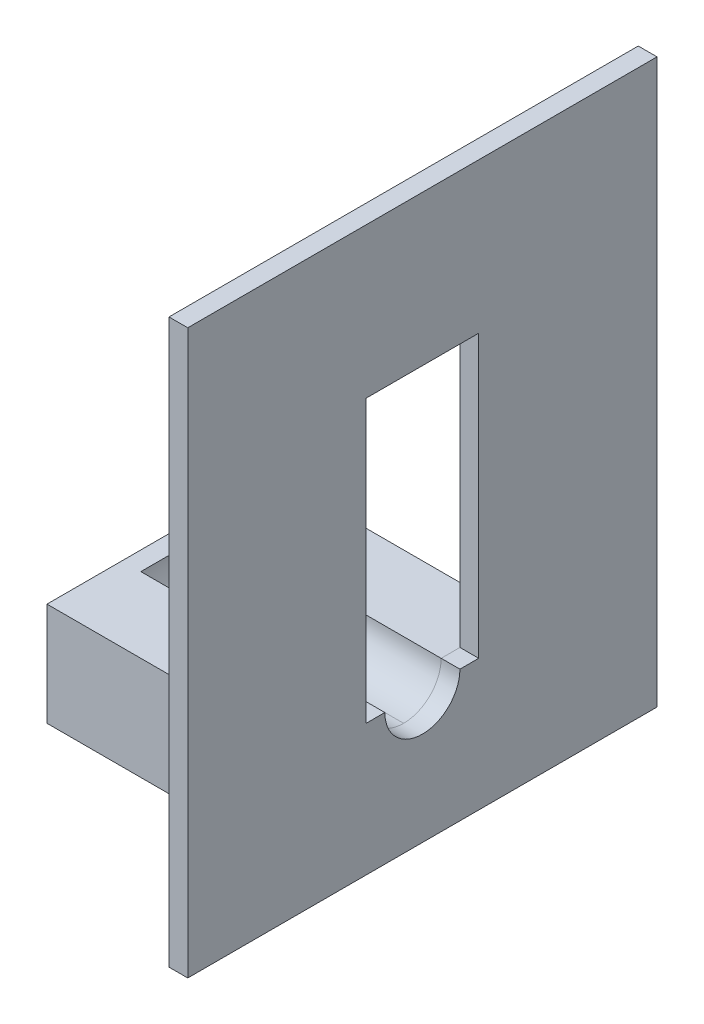
ISO-10303-21;
HEADER;
FILE_DESCRIPTION(('STEP AP214'),'2;1');
FILE_NAME('part.step','',(''),(''),'','','');
FILE_SCHEMA(('AUTOMOTIVE_DESIGN { 1 0 10303 214 1 1 1 1 }'));
ENDSEC;
DATA;
#1=APPLICATION_CONTEXT('core data for automotive mechanical design processes');
#2=APPLICATION_PROTOCOL_DEFINITION('international standard','automotive_design',2000,#1);
#3=PRODUCT_CONTEXT('',#1,'mechanical');
#4=PRODUCT('Part','Part','',(#3));
#5=PRODUCT_RELATED_PRODUCT_CATEGORY('part','',(#4));
#6=PRODUCT_DEFINITION_FORMATION('','',#4);
#7=PRODUCT_DEFINITION_CONTEXT('part definition',#1,'design');
#8=PRODUCT_DEFINITION('design','',#6,#7);
#9=PRODUCT_DEFINITION_SHAPE('','',#8);
#10=(LENGTH_UNIT() NAMED_UNIT(*) SI_UNIT(.MILLI.,.METRE.));
#11=(NAMED_UNIT(*) PLANE_ANGLE_UNIT() SI_UNIT($,.RADIAN.));
#12=(NAMED_UNIT(*) SI_UNIT($,.STERADIAN.) SOLID_ANGLE_UNIT());
#13=UNCERTAINTY_MEASURE_WITH_UNIT(LENGTH_MEASURE(1.E-05),#10,'distance_accuracy_value','');
#14=(GEOMETRIC_REPRESENTATION_CONTEXT(3) GLOBAL_UNCERTAINTY_ASSIGNED_CONTEXT((#13)) GLOBAL_UNIT_ASSIGNED_CONTEXT((#10,
#11,#12)) REPRESENTATION_CONTEXT('',''));
#15=CARTESIAN_POINT('',(0.,0.,0.));
#16=DIRECTION('',(0.,0.,1.));
#17=DIRECTION('',(1.,0.,0.));
#18=AXIS2_PLACEMENT_3D('',#15,#16,#17);
#19=CARTESIAN_POINT('',(7.5,0.,0.));
#20=DIRECTION('',(1.,0.,0.));
#21=DIRECTION('',(0.,0.,-1.));
#22=AXIS2_PLACEMENT_3D('',#19,#20,#21);
#23=PLANE('',#22);
#24=DIRECTION('',(0.,-1.,0.));
#25=VECTOR('',#24,1.);
#26=CARTESIAN_POINT('',(7.5,25.5,12.5));
#27=LINE('',#26,#25);
#28=CARTESIAN_POINT('',(7.5,25.5,12.5));
#29=VERTEX_POINT('',#28);
#30=CARTESIAN_POINT('',(7.5,-4.5,12.5));
#31=VERTEX_POINT('',#30);
#32=EDGE_CURVE('E172',#29,#31,#27,.T.);
#33=ORIENTED_EDGE('',*,*,#32,.T.);
#34=DIRECTION('',(0.,0.,-1.));
#35=VECTOR('',#34,1.);
#36=CARTESIAN_POINT('',(7.5,-4.5,12.5));
#37=LINE('',#36,#35);
#38=CARTESIAN_POINT('',(7.5,-4.49999999999999,-12.5));
#39=VERTEX_POINT('',#38);
#40=EDGE_CURVE('E175',#31,#39,#37,.T.);
#41=ORIENTED_EDGE('',*,*,#40,.T.);
#42=DIRECTION('',(0.,1.,0.));
#43=VECTOR('',#42,1.);
#44=CARTESIAN_POINT('',(7.5,25.5,-12.5));
#45=LINE('',#44,#43);
#46=CARTESIAN_POINT('',(7.5,25.5,-12.5));
#47=VERTEX_POINT('',#46);
#48=EDGE_CURVE('E178',#39,#47,#45,.T.);
#49=ORIENTED_EDGE('',*,*,#48,.T.);
#50=DIRECTION('',(0.,0.,1.));
#51=VECTOR('',#50,1.);
#52=CARTESIAN_POINT('',(7.5,25.5,12.5));
#53=LINE('',#52,#51);
#54=EDGE_CURVE('E180',#47,#29,#53,.T.);
#55=ORIENTED_EDGE('',*,*,#54,.T.);
#56=EDGE_LOOP('',(#33,#41,#49,#55));
#57=FACE_BOUND('',#56,.T.);
#58=DIRECTION('',(0.,0.,1.));
#59=VECTOR('',#58,1.);
#60=CARTESIAN_POINT('',(7.5,17.5,3.));
#61=LINE('',#60,#59);
#62=CARTESIAN_POINT('',(7.5,17.5,-3.));
#63=VERTEX_POINT('',#62);
#64=CARTESIAN_POINT('',(7.5,17.5,3.));
#65=VERTEX_POINT('',#64);
#66=EDGE_CURVE('E129',#63,#65,#61,.T.);
#67=ORIENTED_EDGE('',*,*,#66,.F.);
#68=DIRECTION('',(0.,1.,0.));
#69=VECTOR('',#68,1.);
#70=CARTESIAN_POINT('',(7.5,2.5,-3.));
#71=LINE('',#70,#69);
#72=CARTESIAN_POINT('',(7.5,2.5,-3.));
#73=VERTEX_POINT('',#72);
#74=EDGE_CURVE('E121',#73,#63,#71,.T.);
#75=ORIENTED_EDGE('',*,*,#74,.F.);
#76=DIRECTION('',(0.,0.,-1.));
#77=VECTOR('',#76,1.);
#78=CARTESIAN_POINT('',(7.5,2.5,-2.));
#79=LINE('',#78,#77);
#80=CARTESIAN_POINT('',(7.5,2.5,-2.));
#81=VERTEX_POINT('',#80);
#82=EDGE_CURVE('E150',#81,#73,#79,.T.);
#83=ORIENTED_EDGE('',*,*,#82,.F.);
#84=CARTESIAN_POINT('',(7.5,2.5,0.));
#85=DIRECTION('',(1.,0.,0.));
#86=DIRECTION('',(0.,0.,-1.));
#87=AXIS2_PLACEMENT_3D('',#84,#85,#86);
#88=CIRCLE('',#87,2.);
#89=CARTESIAN_POINT('',(7.5,2.5,2.));
#90=VERTEX_POINT('',#89);
#91=EDGE_CURVE('E148',#90,#81,#88,.T.);
#92=ORIENTED_EDGE('',*,*,#91,.F.);
#93=DIRECTION('',(0.,0.,-1.));
#94=VECTOR('',#93,1.);
#95=CARTESIAN_POINT('',(7.5,2.5,2.));
#96=LINE('',#95,#94);
#97=CARTESIAN_POINT('',(7.5,2.5,3.));
#98=VERTEX_POINT('',#97);
#99=EDGE_CURVE('E144',#98,#90,#96,.T.);
#100=ORIENTED_EDGE('',*,*,#99,.F.);
#101=DIRECTION('',(0.,-1.,0.));
#102=VECTOR('',#101,1.);
#103=CARTESIAN_POINT('',(7.5,2.5,3.));
#104=LINE('',#103,#102);
#105=EDGE_CURVE('E142',#65,#98,#104,.T.);
#106=ORIENTED_EDGE('',*,*,#105,.F.);
#107=EDGE_LOOP('',(#67,#75,#83,#92,#100,#106));
#108=FACE_BOUND('',#107,.T.);
#109=ADVANCED_FACE('F44',(#57,#108),#23,.T.);
#110=CARTESIAN_POINT('',(6.5,0.,0.));
#111=DIRECTION('',(1.,0.,0.));
#112=DIRECTION('',(0.,0.,-1.));
#113=AXIS2_PLACEMENT_3D('',#110,#111,#112);
#114=PLANE('',#113);
#115=DIRECTION('',(0.,-1.,0.));
#116=VECTOR('',#115,1.);
#117=CARTESIAN_POINT('',(6.5,25.5,12.5));
#118=LINE('',#117,#116);
#119=CARTESIAN_POINT('',(6.5,25.5,12.5));
#120=VERTEX_POINT('',#119);
#121=CARTESIAN_POINT('',(6.5,-4.5,12.5));
#122=VERTEX_POINT('',#121);
#123=EDGE_CURVE('E137',#120,#122,#118,.T.);
#124=ORIENTED_EDGE('',*,*,#123,.F.);
#125=DIRECTION('',(0.,0.,1.));
#126=VECTOR('',#125,1.);
#127=CARTESIAN_POINT('',(6.5,25.5,12.5));
#128=LINE('',#127,#126);
#129=CARTESIAN_POINT('',(6.5,25.5,-12.5));
#130=VERTEX_POINT('',#129);
#131=EDGE_CURVE('E176',#130,#120,#128,.T.);
#132=ORIENTED_EDGE('',*,*,#131,.F.);
#133=DIRECTION('',(0.,1.,0.));
#134=VECTOR('',#133,1.);
#135=CARTESIAN_POINT('',(6.5,25.5,-12.5));
#136=LINE('',#135,#134);
#137=CARTESIAN_POINT('',(6.5,-4.49999999999999,-12.5));
#138=VERTEX_POINT('',#137);
#139=EDGE_CURVE('E187',#138,#130,#136,.T.);
#140=ORIENTED_EDGE('',*,*,#139,.F.);
#141=DIRECTION('',(0.,0.,-1.));
#142=VECTOR('',#141,1.);
#143=CARTESIAN_POINT('',(6.5,-4.5,12.5));
#144=LINE('',#143,#142);
#145=EDGE_CURVE('E185',#122,#138,#144,.T.);
#146=ORIENTED_EDGE('',*,*,#145,.F.);
#147=EDGE_LOOP('',(#124,#132,#140,#146));
#148=FACE_BOUND('',#147,.T.);
#149=DIRECTION('',(0.,1.,0.));
#150=VECTOR('',#149,1.);
#151=CARTESIAN_POINT('',(6.5,2.5,-3.));
#152=LINE('',#151,#150);
#153=CARTESIAN_POINT('',(6.5,2.5,-3.));
#154=VERTEX_POINT('',#153);
#155=CARTESIAN_POINT('',(6.5,17.5,-3.));
#156=VERTEX_POINT('',#155);
#157=EDGE_CURVE('E67',#154,#156,#152,.T.);
#158=ORIENTED_EDGE('',*,*,#157,.T.);
#159=DIRECTION('',(0.,0.,1.));
#160=VECTOR('',#159,1.);
#161=CARTESIAN_POINT('',(6.5,17.5,3.));
#162=LINE('',#161,#160);
#163=CARTESIAN_POINT('',(6.5,17.5,3.));
#164=VERTEX_POINT('',#163);
#165=EDGE_CURVE('E136',#156,#164,#162,.T.);
#166=ORIENTED_EDGE('',*,*,#165,.T.);
#167=DIRECTION('',(0.,-1.,0.));
#168=VECTOR('',#167,1.);
#169=CARTESIAN_POINT('',(6.5,2.5,3.));
#170=LINE('',#169,#168);
#171=CARTESIAN_POINT('',(6.5,2.5,3.));
#172=VERTEX_POINT('',#171);
#173=EDGE_CURVE('E154',#164,#172,#170,.T.);
#174=ORIENTED_EDGE('',*,*,#173,.T.);
#175=DIRECTION('',(0.,0.,-1.));
#176=VECTOR('',#175,1.);
#177=CARTESIAN_POINT('',(6.5,2.5,2.));
#178=LINE('',#177,#176);
#179=CARTESIAN_POINT('',(6.5,2.5,2.));
#180=VERTEX_POINT('',#179);
#181=EDGE_CURVE('E157',#172,#180,#178,.T.);
#182=ORIENTED_EDGE('',*,*,#181,.T.);
#183=CARTESIAN_POINT('',(6.5,2.5,0.));
#184=DIRECTION('',(1.,0.,0.));
#185=DIRECTION('',(0.,0.,-1.));
#186=AXIS2_PLACEMENT_3D('',#183,#184,#185);
#187=CIRCLE('',#186,2.);
#188=CARTESIAN_POINT('',(6.5,2.5,-2.));
#189=VERTEX_POINT('',#188);
#190=EDGE_CURVE('E160',#180,#189,#187,.T.);
#191=ORIENTED_EDGE('',*,*,#190,.T.);
#192=DIRECTION('',(0.,0.,-1.));
#193=VECTOR('',#192,1.);
#194=CARTESIAN_POINT('',(6.5,2.5,-2.));
#195=LINE('',#194,#193);
#196=EDGE_CURVE('E130',#189,#154,#195,.T.);
#197=ORIENTED_EDGE('',*,*,#196,.T.);
#198=EDGE_LOOP('',(#158,#166,#174,#182,#191,#197));
#199=FACE_BOUND('',#198,.T.);
#200=ADVANCED_FACE('F205',(#148,#199),#114,.F.);
#201=CARTESIAN_POINT('',(7.5,25.5,12.5));
#202=DIRECTION('',(0.,0.,-1.));
#203=DIRECTION('',(0.,1.,0.));
#204=AXIS2_PLACEMENT_3D('',#201,#202,#203);
#205=PLANE('',#204);
#206=ORIENTED_EDGE('',*,*,#123,.T.);
#207=DIRECTION('',(-1.,0.,0.));
#208=VECTOR('',#207,1.);
#209=CARTESIAN_POINT('',(7.5,-4.5,12.5));
#210=LINE('',#209,#208);
#211=EDGE_CURVE('E12',#31,#122,#210,.T.);
#212=ORIENTED_EDGE('',*,*,#211,.F.);
#213=ORIENTED_EDGE('',*,*,#32,.F.);
#214=DIRECTION('',(-1.,0.,0.));
#215=VECTOR('',#214,1.);
#216=CARTESIAN_POINT('',(7.5,25.5,12.5));
#217=LINE('',#216,#215);
#218=EDGE_CURVE('E182',#29,#120,#217,.T.);
#219=ORIENTED_EDGE('',*,*,#218,.T.);
#220=EDGE_LOOP('',(#206,#212,#213,#219));
#221=FACE_BOUND('',#220,.T.);
#222=ADVANCED_FACE('F46',(#221),#205,.F.);
#223=CARTESIAN_POINT('',(7.5,-4.5,12.5));
#224=DIRECTION('',(0.,1.,0.));
#225=DIRECTION('',(0.,0.,1.));
#226=AXIS2_PLACEMENT_3D('',#223,#224,#225);
#227=PLANE('',#226);
#228=ORIENTED_EDGE('',*,*,#145,.T.);
#229=DIRECTION('',(-1.,0.,0.));
#230=VECTOR('',#229,1.);
#231=CARTESIAN_POINT('',(7.5,-4.49999999999999,-12.5));
#232=LINE('',#231,#230);
#233=EDGE_CURVE('E52',#39,#138,#232,.T.);
#234=ORIENTED_EDGE('',*,*,#233,.F.);
#235=ORIENTED_EDGE('',*,*,#40,.F.);
#236=ORIENTED_EDGE('',*,*,#211,.T.);
#237=EDGE_LOOP('',(#228,#234,#235,#236));
#238=FACE_BOUND('',#237,.T.);
#239=ADVANCED_FACE('F215',(#238),#227,.F.);
#240=CARTESIAN_POINT('',(7.5,25.5,-12.5));
#241=DIRECTION('',(0.,0.,1.));
#242=DIRECTION('',(0.,-1.,0.));
#243=AXIS2_PLACEMENT_3D('',#240,#241,#242);
#244=PLANE('',#243);
#245=ORIENTED_EDGE('',*,*,#139,.T.);
#246=DIRECTION('',(-1.,0.,0.));
#247=VECTOR('',#246,1.);
#248=CARTESIAN_POINT('',(7.5,25.5,-12.5));
#249=LINE('',#248,#247);
#250=EDGE_CURVE('E192',#47,#130,#249,.T.);
#251=ORIENTED_EDGE('',*,*,#250,.F.);
#252=ORIENTED_EDGE('',*,*,#48,.F.);
#253=ORIENTED_EDGE('',*,*,#233,.T.);
#254=EDGE_LOOP('',(#245,#251,#252,#253));
#255=FACE_BOUND('',#254,.T.);
#256=ADVANCED_FACE('F199',(#255),#244,.F.);
#257=CARTESIAN_POINT('',(7.5,25.5,12.5));
#258=DIRECTION('',(0.,-1.,0.));
#259=DIRECTION('',(0.,0.,-1.));
#260=AXIS2_PLACEMENT_3D('',#257,#258,#259);
#261=PLANE('',#260);
#262=ORIENTED_EDGE('',*,*,#131,.T.);
#263=ORIENTED_EDGE('',*,*,#218,.F.);
#264=ORIENTED_EDGE('',*,*,#54,.F.);
#265=ORIENTED_EDGE('',*,*,#250,.T.);
#266=EDGE_LOOP('',(#262,#263,#264,#265));
#267=FACE_BOUND('',#266,.T.);
#268=ADVANCED_FACE('F209',(#267),#261,.F.);
#269=CARTESIAN_POINT('',(7.5,2.5,-3.));
#270=DIRECTION('',(0.,0.,1.));
#271=DIRECTION('',(1.,0.,0.));
#272=AXIS2_PLACEMENT_3D('',#269,#270,#271);
#273=PLANE('',#272);
#274=ORIENTED_EDGE('',*,*,#157,.F.);
#275=DIRECTION('',(-1.,0.,0.));
#276=VECTOR('',#275,1.);
#277=CARTESIAN_POINT('',(7.5,2.5,-3.));
#278=LINE('',#277,#276);
#279=EDGE_CURVE('E125',#73,#154,#278,.T.);
#280=ORIENTED_EDGE('',*,*,#279,.F.);
#281=ORIENTED_EDGE('',*,*,#74,.T.);
#282=DIRECTION('',(-1.,0.,0.));
#283=VECTOR('',#282,1.);
#284=CARTESIAN_POINT('',(7.5,17.5,-3.));
#285=LINE('',#284,#283);
#286=EDGE_CURVE('E124',#63,#156,#285,.T.);
#287=ORIENTED_EDGE('',*,*,#286,.T.);
#288=EDGE_LOOP('',(#274,#280,#281,#287));
#289=FACE_BOUND('',#288,.T.);
#290=ADVANCED_FACE('F123',(#289),#273,.T.);
#291=CARTESIAN_POINT('',(7.5,17.5,3.));
#292=DIRECTION('',(0.,-1.,0.));
#293=DIRECTION('',(0.,0.,-1.));
#294=AXIS2_PLACEMENT_3D('',#291,#292,#293);
#295=PLANE('',#294);
#296=ORIENTED_EDGE('',*,*,#165,.F.);
#297=ORIENTED_EDGE('',*,*,#286,.F.);
#298=ORIENTED_EDGE('',*,*,#66,.T.);
#299=DIRECTION('',(-1.,0.,0.));
#300=VECTOR('',#299,1.);
#301=CARTESIAN_POINT('',(7.5,17.5,3.));
#302=LINE('',#301,#300);
#303=EDGE_CURVE('E138',#65,#164,#302,.T.);
#304=ORIENTED_EDGE('',*,*,#303,.T.);
#305=EDGE_LOOP('',(#296,#297,#298,#304));
#306=FACE_BOUND('',#305,.T.);
#307=ADVANCED_FACE('F133',(#306),#295,.T.);
#308=CARTESIAN_POINT('',(7.5,2.5,3.));
#309=DIRECTION('',(0.,0.,-1.));
#310=DIRECTION('',(-1.,0.,0.));
#311=AXIS2_PLACEMENT_3D('',#308,#309,#310);
#312=PLANE('',#311);
#313=ORIENTED_EDGE('',*,*,#173,.F.);
#314=ORIENTED_EDGE('',*,*,#303,.F.);
#315=ORIENTED_EDGE('',*,*,#105,.T.);
#316=DIRECTION('',(-1.,0.,0.));
#317=VECTOR('',#316,1.);
#318=CARTESIAN_POINT('',(7.5,2.5,3.));
#319=LINE('',#318,#317);
#320=EDGE_CURVE('E169',#98,#172,#319,.T.);
#321=ORIENTED_EDGE('',*,*,#320,.T.);
#322=EDGE_LOOP('',(#313,#314,#315,#321));
#323=FACE_BOUND('',#322,.T.);
#324=ADVANCED_FACE('F238',(#323),#312,.T.);
#325=CARTESIAN_POINT('',(7.5,2.5,2.));
#326=DIRECTION('',(0.,1.,0.));
#327=DIRECTION('',(0.,0.,1.));
#328=AXIS2_PLACEMENT_3D('',#325,#326,#327);
#329=PLANE('',#328);
#330=ORIENTED_EDGE('',*,*,#181,.F.);
#331=ORIENTED_EDGE('',*,*,#320,.F.);
#332=ORIENTED_EDGE('',*,*,#99,.T.);
#333=DIRECTION('',(-1.,0.,0.));
#334=VECTOR('',#333,1.);
#335=CARTESIAN_POINT('',(7.5,2.5,2.));
#336=LINE('',#335,#334);
#337=EDGE_CURVE('E167',#90,#180,#336,.T.);
#338=ORIENTED_EDGE('',*,*,#337,.T.);
#339=EDGE_LOOP('',(#330,#331,#332,#338));
#340=FACE_BOUND('',#339,.T.);
#341=ADVANCED_FACE('F242',(#340),#329,.T.);
#342=CARTESIAN_POINT('',(7.5,2.5,0.));
#343=DIRECTION('',(-1.,0.,0.));
#344=DIRECTION('',(0.,0.,1.));
#345=AXIS2_PLACEMENT_3D('',#342,#343,#344);
#346=CYLINDRICAL_SURFACE('',#345,2.);
#347=ORIENTED_EDGE('',*,*,#190,.F.);
#348=ORIENTED_EDGE('',*,*,#337,.F.);
#349=ORIENTED_EDGE('',*,*,#91,.T.);
#350=DIRECTION('',(-1.,0.,0.));
#351=VECTOR('',#350,1.);
#352=CARTESIAN_POINT('',(7.5,2.5,-2.));
#353=LINE('',#352,#351);
#354=EDGE_CURVE('E59',#81,#189,#353,.T.);
#355=ORIENTED_EDGE('',*,*,#354,.T.);
#356=EDGE_LOOP('',(#347,#348,#349,#355));
#357=FACE_BOUND('',#356,.T.);
#358=ADVANCED_FACE('F248',(#357),#346,.F.);
#359=CARTESIAN_POINT('',(7.5,2.5,-2.));
#360=DIRECTION('',(0.,1.,0.));
#361=DIRECTION('',(0.,0.,1.));
#362=AXIS2_PLACEMENT_3D('',#359,#360,#361);
#363=PLANE('',#362);
#364=ORIENTED_EDGE('',*,*,#196,.F.);
#365=ORIENTED_EDGE('',*,*,#354,.F.);
#366=ORIENTED_EDGE('',*,*,#82,.T.);
#367=ORIENTED_EDGE('',*,*,#279,.T.);
#368=EDGE_LOOP('',(#364,#365,#366,#367));
#369=FACE_BOUND('',#368,.T.);
#370=ADVANCED_FACE('F252',(#369),#363,.T.);
#371=CLOSED_SHELL('',(#109,#200,#222,#239,#256,#268,#290,#307,#324,#341,#358,#370));
#372=MANIFOLD_SOLID_BREP('B2',#371);
#373=CARTESIAN_POINT('',(0.,0.,0.));
#374=DIRECTION('',(0.,-1.,0.));
#375=DIRECTION('',(0.,0.,-1.));
#376=AXIS2_PLACEMENT_3D('',#373,#374,#375);
#377=PLANE('',#376);
#378=DIRECTION('',(0.,0.,1.));
#379=VECTOR('',#378,1.);
#380=CARTESIAN_POINT('',(-6.5,0.,6.));
#381=LINE('',#380,#379);
#382=CARTESIAN_POINT('',(-6.5,0.,-4.));
#383=VERTEX_POINT('',#382);
#384=CARTESIAN_POINT('',(-6.5,0.,4.));
#385=VERTEX_POINT('',#384);
#386=EDGE_CURVE('E425',#383,#385,#381,.T.);
#387=ORIENTED_EDGE('',*,*,#386,.F.);
#388=DIRECTION('',(-1.,0.,0.));
#389=VECTOR('',#388,1.);
#390=CARTESIAN_POINT('',(-6.5,0.,-4.));
#391=LINE('',#390,#389);
#392=CARTESIAN_POINT('',(6.5,0.,-4.));
#393=VERTEX_POINT('',#392);
#394=EDGE_CURVE('E542',#393,#383,#391,.T.);
#395=ORIENTED_EDGE('',*,*,#394,.F.);
#396=DIRECTION('',(0.,0.,-1.));
#397=VECTOR('',#396,1.);
#398=CARTESIAN_POINT('',(6.5,0.,6.));
#399=LINE('',#398,#397);
#400=CARTESIAN_POINT('',(6.5,0.,4.));
#401=VERTEX_POINT('',#400);
#402=EDGE_CURVE('E429',#401,#393,#399,.T.);
#403=ORIENTED_EDGE('',*,*,#402,.F.);
#404=DIRECTION('',(1.,0.,0.));
#405=VECTOR('',#404,1.);
#406=CARTESIAN_POINT('',(-6.5,0.,4.));
#407=LINE('',#406,#405);
#408=EDGE_CURVE('E448',#385,#401,#407,.T.);
#409=ORIENTED_EDGE('',*,*,#408,.F.);
#410=EDGE_LOOP('',(#387,#395,#403,#409));
#411=FACE_BOUND('',#410,.T.);
#412=ADVANCED_FACE('F325',(#411),#377,.T.);
#413=CARTESIAN_POINT('',(6.5,2.5,6.));
#414=DIRECTION('',(-1.,0.,0.));
#415=DIRECTION('',(0.,0.,1.));
#416=AXIS2_PLACEMENT_3D('',#413,#414,#415);
#417=PLANE('',#416);
#418=DIRECTION('',(0.,0.,-1.));
#419=VECTOR('',#418,1.);
#420=CARTESIAN_POINT('',(6.5,2.5,6.));
#421=LINE('',#420,#419);
#422=CARTESIAN_POINT('',(6.5,2.5,-2.));
#423=VERTEX_POINT('',#422);
#424=CARTESIAN_POINT('',(6.5,2.5,-6.));
#425=VERTEX_POINT('',#424);
#426=EDGE_CURVE('E428',#423,#425,#421,.T.);
#427=ORIENTED_EDGE('',*,*,#426,.F.);
#428=CARTESIAN_POINT('',(6.5,2.5,0.));
#429=DIRECTION('',(-1.,0.,0.));
#430=DIRECTION('',(0.,0.,1.));
#431=AXIS2_PLACEMENT_3D('',#428,#429,#430);
#432=CIRCLE('',#431,2.);
#433=CARTESIAN_POINT('',(6.5,0.5,0.));
#434=VERTEX_POINT('',#433);
#435=EDGE_CURVE('E42',#423,#434,#432,.T.);
#436=ORIENTED_EDGE('',*,*,#435,.T.);
#437=CARTESIAN_POINT('',(6.5,2.5,0.));
#438=DIRECTION('',(-1.,0.,0.));
#439=DIRECTION('',(0.,0.,1.));
#440=AXIS2_PLACEMENT_3D('',#437,#438,#439);
#441=CIRCLE('',#440,2.);
#442=CARTESIAN_POINT('',(6.5,2.5,2.));
#443=VERTEX_POINT('',#442);
#444=EDGE_CURVE('E335',#434,#443,#441,.T.);
#445=ORIENTED_EDGE('',*,*,#444,.T.);
#446=CARTESIAN_POINT('',(6.5,2.5,6.));
#447=VERTEX_POINT('',#446);
#448=EDGE_CURVE('E461',#447,#443,#421,.T.);
#449=ORIENTED_EDGE('',*,*,#448,.F.);
#450=DIRECTION('',(0.,-1.,0.));
#451=VECTOR('',#450,1.);
#452=CARTESIAN_POINT('',(6.5,2.5,6.));
#453=LINE('',#452,#451);
#454=CARTESIAN_POINT('',(6.5,-3.,6.));
#455=VERTEX_POINT('',#454);
#456=EDGE_CURVE('E437',#447,#455,#453,.T.);
#457=ORIENTED_EDGE('',*,*,#456,.T.);
#458=DIRECTION('',(0.,0.,1.));
#459=VECTOR('',#458,1.);
#460=CARTESIAN_POINT('',(6.5,-3.,6.));
#461=LINE('',#460,#459);
#462=CARTESIAN_POINT('',(6.5,-3.,4.));
#463=VERTEX_POINT('',#462);
#464=EDGE_CURVE('E556',#463,#455,#461,.T.);
#465=ORIENTED_EDGE('',*,*,#464,.F.);
#466=DIRECTION('',(0.,1.,0.));
#467=VECTOR('',#466,1.);
#468=CARTESIAN_POINT('',(6.5,-3.,4.));
#469=LINE('',#468,#467);
#470=EDGE_CURVE('E454',#463,#401,#469,.T.);
#471=ORIENTED_EDGE('',*,*,#470,.T.);
#472=ORIENTED_EDGE('',*,*,#402,.T.);
#473=DIRECTION('',(0.,1.,0.));
#474=VECTOR('',#473,1.);
#475=CARTESIAN_POINT('',(6.5,-3.,-4.));
#476=LINE('',#475,#474);
#477=CARTESIAN_POINT('',(6.5,-3.,-4.));
#478=VERTEX_POINT('',#477);
#479=EDGE_CURVE('E453',#478,#393,#476,.T.);
#480=ORIENTED_EDGE('',*,*,#479,.F.);
#481=DIRECTION('',(0.,0.,1.));
#482=VECTOR('',#481,1.);
#483=CARTESIAN_POINT('',(6.5,-3.,-6.));
#484=LINE('',#483,#482);
#485=CARTESIAN_POINT('',(6.5,-3.,-6.));
#486=VERTEX_POINT('',#485);
#487=EDGE_CURVE('E537',#486,#478,#484,.T.);
#488=ORIENTED_EDGE('',*,*,#487,.F.);
#489=DIRECTION('',(0.,-1.,0.));
#490=VECTOR('',#489,1.);
#491=CARTESIAN_POINT('',(6.5,2.5,-6.));
#492=LINE('',#491,#490);
#493=EDGE_CURVE('E424',#425,#486,#492,.T.);
#494=ORIENTED_EDGE('',*,*,#493,.F.);
#495=EDGE_LOOP('',(#427,#436,#445,#449,#457,#465,#471,#472,#480,#488,#494));
#496=FACE_BOUND('',#495,.T.);
#497=ADVANCED_FACE('F478',(#496),#417,.F.);
#498=CARTESIAN_POINT('',(-6.5,2.5,-6.));
#499=DIRECTION('',(0.,0.,1.));
#500=DIRECTION('',(1.,0.,0.));
#501=AXIS2_PLACEMENT_3D('',#498,#499,#500);
#502=PLANE('',#501);
#503=ORIENTED_EDGE('',*,*,#493,.T.);
#504=DIRECTION('',(1.,0.,0.));
#505=VECTOR('',#504,1.);
#506=CARTESIAN_POINT('',(-6.5,-3.,-6.));
#507=LINE('',#506,#505);
#508=CARTESIAN_POINT('',(-6.5,-3.,-6.));
#509=VERTEX_POINT('',#508);
#510=EDGE_CURVE('E535',#509,#486,#507,.T.);
#511=ORIENTED_EDGE('',*,*,#510,.F.);
#512=DIRECTION('',(0.,-1.,0.));
#513=VECTOR('',#512,1.);
#514=CARTESIAN_POINT('',(-6.5,2.5,-6.));
#515=LINE('',#514,#513);
#516=CARTESIAN_POINT('',(-6.5,2.5,-6.));
#517=VERTEX_POINT('',#516);
#518=EDGE_CURVE('E442',#517,#509,#515,.T.);
#519=ORIENTED_EDGE('',*,*,#518,.F.);
#520=DIRECTION('',(-1.,0.,0.));
#521=VECTOR('',#520,1.);
#522=CARTESIAN_POINT('',(-6.5,2.5,-6.));
#523=LINE('',#522,#521);
#524=EDGE_CURVE('E463',#425,#517,#523,.T.);
#525=ORIENTED_EDGE('',*,*,#524,.F.);
#526=EDGE_LOOP('',(#503,#511,#519,#525));
#527=FACE_BOUND('',#526,.T.);
#528=ADVANCED_FACE('F481',(#527),#502,.F.);
#529=CARTESIAN_POINT('',(-6.5,2.5,6.));
#530=DIRECTION('',(1.,0.,0.));
#531=DIRECTION('',(0.,0.,-1.));
#532=AXIS2_PLACEMENT_3D('',#529,#530,#531);
#533=PLANE('',#532);
#534=ORIENTED_EDGE('',*,*,#518,.T.);
#535=DIRECTION('',(0.,0.,-1.));
#536=VECTOR('',#535,1.);
#537=CARTESIAN_POINT('',(-6.5,-3.,-6.));
#538=LINE('',#537,#536);
#539=CARTESIAN_POINT('',(-6.5,-3.,-4.));
#540=VERTEX_POINT('',#539);
#541=EDGE_CURVE('E532',#540,#509,#538,.T.);
#542=ORIENTED_EDGE('',*,*,#541,.F.);
#543=DIRECTION('',(0.,1.,0.));
#544=VECTOR('',#543,1.);
#545=CARTESIAN_POINT('',(-6.5,-3.,-4.));
#546=LINE('',#545,#544);
#547=EDGE_CURVE('E549',#540,#383,#546,.T.);
#548=ORIENTED_EDGE('',*,*,#547,.T.);
#549=ORIENTED_EDGE('',*,*,#386,.T.);
#550=DIRECTION('',(0.,1.,0.));
#551=VECTOR('',#550,1.);
#552=CARTESIAN_POINT('',(-6.5,-3.,4.));
#553=LINE('',#552,#551);
#554=CARTESIAN_POINT('',(-6.5,-3.,4.));
#555=VERTEX_POINT('',#554);
#556=EDGE_CURVE('E447',#555,#385,#553,.T.);
#557=ORIENTED_EDGE('',*,*,#556,.F.);
#558=DIRECTION('',(0.,0.,-1.));
#559=VECTOR('',#558,1.);
#560=CARTESIAN_POINT('',(-6.5,-3.,6.));
#561=LINE('',#560,#559);
#562=CARTESIAN_POINT('',(-6.5,-3.,6.));
#563=VERTEX_POINT('',#562);
#564=EDGE_CURVE('E452',#563,#555,#561,.T.);
#565=ORIENTED_EDGE('',*,*,#564,.F.);
#566=DIRECTION('',(0.,-1.,0.));
#567=VECTOR('',#566,1.);
#568=CARTESIAN_POINT('',(-6.5,2.5,6.));
#569=LINE('',#568,#567);
#570=CARTESIAN_POINT('',(-6.5,2.5,6.));
#571=VERTEX_POINT('',#570);
#572=EDGE_CURVE('E439',#571,#563,#569,.T.);
#573=ORIENTED_EDGE('',*,*,#572,.F.);
#574=DIRECTION('',(0.,0.,1.));
#575=VECTOR('',#574,1.);
#576=CARTESIAN_POINT('',(-6.5,2.5,6.));
#577=LINE('',#576,#575);
#578=EDGE_CURVE('E465',#517,#571,#577,.T.);
#579=ORIENTED_EDGE('',*,*,#578,.F.);
#580=EDGE_LOOP('',(#534,#542,#548,#549,#557,#565,#573,#579));
#581=FACE_BOUND('',#580,.T.);
#582=ADVANCED_FACE('F487',(#581),#533,.F.);
#583=CARTESIAN_POINT('',(-6.5,2.5,6.));
#584=DIRECTION('',(0.,0.,-1.));
#585=DIRECTION('',(-1.,0.,0.));
#586=AXIS2_PLACEMENT_3D('',#583,#584,#585);
#587=PLANE('',#586);
#588=ORIENTED_EDGE('',*,*,#572,.T.);
#589=DIRECTION('',(-1.,0.,0.));
#590=VECTOR('',#589,1.);
#591=CARTESIAN_POINT('',(-6.5,-3.,6.));
#592=LINE('',#591,#590);
#593=EDGE_CURVE('E459',#455,#563,#592,.T.);
#594=ORIENTED_EDGE('',*,*,#593,.F.);
#595=ORIENTED_EDGE('',*,*,#456,.F.);
#596=DIRECTION('',(1.,0.,0.));
#597=VECTOR('',#596,1.);
#598=CARTESIAN_POINT('',(-6.5,2.5,6.));
#599=LINE('',#598,#597);
#600=EDGE_CURVE('E440',#571,#447,#599,.T.);
#601=ORIENTED_EDGE('',*,*,#600,.F.);
#602=EDGE_LOOP('',(#588,#594,#595,#601));
#603=FACE_BOUND('',#602,.T.);
#604=ADVANCED_FACE('F474',(#603),#587,.F.);
#605=CARTESIAN_POINT('',(0.,2.5,0.));
#606=DIRECTION('',(0.,-1.,0.));
#607=DIRECTION('',(0.,0.,-1.));
#608=AXIS2_PLACEMENT_3D('',#605,#606,#607);
#609=PLANE('',#608);
#610=DIRECTION('',(0.,0.,1.));
#611=VECTOR('',#610,1.);
#612=CARTESIAN_POINT('',(-5.5,2.5,2.));
#613=LINE('',#612,#611);
#614=CARTESIAN_POINT('',(-5.5,2.5,-2.));
#615=VERTEX_POINT('',#614);
#616=CARTESIAN_POINT('',(-5.5,2.5,2.));
#617=VERTEX_POINT('',#616);
#618=EDGE_CURVE('E415',#615,#617,#613,.T.);
#619=ORIENTED_EDGE('',*,*,#618,.F.);
#620=DIRECTION('',(-1.,0.,0.));
#621=VECTOR('',#620,1.);
#622=CARTESIAN_POINT('',(-5.5,2.5,-2.));
#623=LINE('',#622,#621);
#624=EDGE_CURVE('E412',#423,#615,#623,.T.);
#625=ORIENTED_EDGE('',*,*,#624,.F.);
#626=ORIENTED_EDGE('',*,*,#426,.T.);
#627=ORIENTED_EDGE('',*,*,#524,.T.);
#628=ORIENTED_EDGE('',*,*,#578,.T.);
#629=ORIENTED_EDGE('',*,*,#600,.T.);
#630=ORIENTED_EDGE('',*,*,#448,.T.);
#631=DIRECTION('',(1.,0.,0.));
#632=VECTOR('',#631,1.);
#633=CARTESIAN_POINT('',(-5.5,2.5,2.));
#634=LINE('',#633,#632);
#635=EDGE_CURVE('E567',#617,#443,#634,.T.);
#636=ORIENTED_EDGE('',*,*,#635,.F.);
#637=EDGE_LOOP('',(#619,#625,#626,#627,#628,#629,#630,#636));
#638=FACE_BOUND('',#637,.T.);
#639=ADVANCED_FACE('F469',(#638),#609,.F.);
#640=CARTESIAN_POINT('',(-6.5,-3.,4.));
#641=DIRECTION('',(0.,0.,1.));
#642=DIRECTION('',(1.,0.,0.));
#643=AXIS2_PLACEMENT_3D('',#640,#641,#642);
#644=PLANE('',#643);
#645=ORIENTED_EDGE('',*,*,#408,.T.);
#646=ORIENTED_EDGE('',*,*,#470,.F.);
#647=DIRECTION('',(1.,0.,0.));
#648=VECTOR('',#647,1.);
#649=CARTESIAN_POINT('',(-6.5,-3.,4.));
#650=LINE('',#649,#648);
#651=EDGE_CURVE('E555',#555,#463,#650,.T.);
#652=ORIENTED_EDGE('',*,*,#651,.F.);
#653=ORIENTED_EDGE('',*,*,#556,.T.);
#654=EDGE_LOOP('',(#645,#646,#652,#653));
#655=FACE_BOUND('',#654,.T.);
#656=ADVANCED_FACE('F516',(#655),#644,.F.);
#657=CARTESIAN_POINT('',(0.,-3.,0.));
#658=DIRECTION('',(0.,-1.,0.));
#659=DIRECTION('',(0.,0.,-1.));
#660=AXIS2_PLACEMENT_3D('',#657,#658,#659);
#661=PLANE('',#660);
#662=ORIENTED_EDGE('',*,*,#564,.T.);
#663=ORIENTED_EDGE('',*,*,#651,.T.);
#664=ORIENTED_EDGE('',*,*,#464,.T.);
#665=ORIENTED_EDGE('',*,*,#593,.T.);
#666=EDGE_LOOP('',(#662,#663,#664,#665));
#667=FACE_BOUND('',#666,.T.);
#668=ADVANCED_FACE('F509',(#667),#661,.T.);
#669=CARTESIAN_POINT('',(-6.5,-3.,-4.));
#670=DIRECTION('',(0.,0.,-1.));
#671=DIRECTION('',(-1.,0.,0.));
#672=AXIS2_PLACEMENT_3D('',#669,#670,#671);
#673=PLANE('',#672);
#674=ORIENTED_EDGE('',*,*,#394,.T.);
#675=ORIENTED_EDGE('',*,*,#547,.F.);
#676=DIRECTION('',(-1.,0.,0.));
#677=VECTOR('',#676,1.);
#678=CARTESIAN_POINT('',(-6.5,-3.,-4.));
#679=LINE('',#678,#677);
#680=EDGE_CURVE('E540',#478,#540,#679,.T.);
#681=ORIENTED_EDGE('',*,*,#680,.F.);
#682=ORIENTED_EDGE('',*,*,#479,.T.);
#683=EDGE_LOOP('',(#674,#675,#681,#682));
#684=FACE_BOUND('',#683,.T.);
#685=ADVANCED_FACE('F503',(#684),#673,.F.);
#686=CARTESIAN_POINT('',(0.,-3.,0.));
#687=DIRECTION('',(0.,1.,0.));
#688=DIRECTION('',(0.,0.,1.));
#689=AXIS2_PLACEMENT_3D('',#686,#687,#688);
#690=PLANE('',#689);
#691=ORIENTED_EDGE('',*,*,#541,.T.);
#692=ORIENTED_EDGE('',*,*,#510,.T.);
#693=ORIENTED_EDGE('',*,*,#487,.T.);
#694=ORIENTED_EDGE('',*,*,#680,.T.);
#695=EDGE_LOOP('',(#691,#692,#693,#694));
#696=FACE_BOUND('',#695,.T.);
#697=ADVANCED_FACE('F499',(#696),#690,.F.);
#698=CARTESIAN_POINT('',(-3.5,2.5,0.));
#699=DIRECTION('',(0.,0.,-1.));
#700=DIRECTION('',(-1.,0.,0.));
#701=AXIS2_PLACEMENT_3D('',#698,#699,#700);
#702=CYLINDRICAL_SURFACE('',#701,2.);
#703=CARTESIAN_POINT('',(-3.5,2.5,0.));
#704=DIRECTION('',(0.707106781186547,0.,-0.707106781186547));
#705=DIRECTION('',(0.707106781186547,0.,0.707106781186547));
#706=AXIS2_PLACEMENT_3D('',#703,#704,#705);
#707=ELLIPSE('',#706,2.82842712474619,2.);
#708=CARTESIAN_POINT('',(-3.5,0.5,0.));
#709=VERTEX_POINT('',#708);
#710=EDGE_CURVE('E329',#615,#709,#707,.F.);
#711=ORIENTED_EDGE('',*,*,#710,.F.);
#712=ORIENTED_EDGE('',*,*,#618,.T.);
#713=CARTESIAN_POINT('',(-3.5,2.5,0.));
#714=DIRECTION('',(-0.707106781186547,0.,-0.707106781186547));
#715=DIRECTION('',(-0.707106781186547,0.,0.707106781186547));
#716=AXIS2_PLACEMENT_3D('',#713,#714,#715);
#717=ELLIPSE('',#716,2.82842712474619,2.);
#718=EDGE_CURVE('E416',#709,#617,#717,.T.);
#719=ORIENTED_EDGE('',*,*,#718,.F.);
#720=EDGE_LOOP('',(#711,#712,#719));
#721=FACE_BOUND('',#720,.T.);
#722=ADVANCED_FACE('F327',(#721),#702,.F.);
#723=CARTESIAN_POINT('',(0.,2.5,0.));
#724=DIRECTION('',(1.,0.,0.));
#725=DIRECTION('',(0.,0.,-1.));
#726=AXIS2_PLACEMENT_3D('',#723,#724,#725);
#727=CYLINDRICAL_SURFACE('',#726,2.);
#728=ORIENTED_EDGE('',*,*,#624,.T.);
#729=ORIENTED_EDGE('',*,*,#710,.T.);
#730=DIRECTION('',(-1.,0.,0.));
#731=VECTOR('',#730,1.);
#732=CARTESIAN_POINT('',(-5.5,0.5,0.));
#733=LINE('',#732,#731);
#734=EDGE_CURVE('E411',#434,#709,#733,.T.);
#735=ORIENTED_EDGE('',*,*,#734,.F.);
#736=ORIENTED_EDGE('',*,*,#435,.F.);
#737=EDGE_LOOP('',(#728,#729,#735,#736));
#738=FACE_BOUND('',#737,.T.);
#739=ADVANCED_FACE('F409',(#738),#727,.F.);
#740=CARTESIAN_POINT('',(0.,2.5,0.));
#741=DIRECTION('',(-1.,0.,0.));
#742=DIRECTION('',(0.,0.,1.));
#743=AXIS2_PLACEMENT_3D('',#740,#741,#742);
#744=CYLINDRICAL_SURFACE('',#743,2.);
#745=ORIENTED_EDGE('',*,*,#718,.T.);
#746=ORIENTED_EDGE('',*,*,#635,.T.);
#747=ORIENTED_EDGE('',*,*,#444,.F.);
#748=ORIENTED_EDGE('',*,*,#734,.T.);
#749=EDGE_LOOP('',(#745,#746,#747,#748));
#750=FACE_BOUND('',#749,.T.);
#751=ADVANCED_FACE('F420',(#750),#744,.F.);
#752=CLOSED_SHELL('',(#412,#497,#528,#582,#604,#639,#656,#668,#685,#697,#722,#739,#751));
#753=MANIFOLD_SOLID_BREP('B6',#752);
#754=ADVANCED_BREP_SHAPE_REPRESENTATION('',(#18,#372,#753),#14);
#755=SHAPE_DEFINITION_REPRESENTATION(#9,#754);
ENDSEC;
END-ISO-10303-21;
